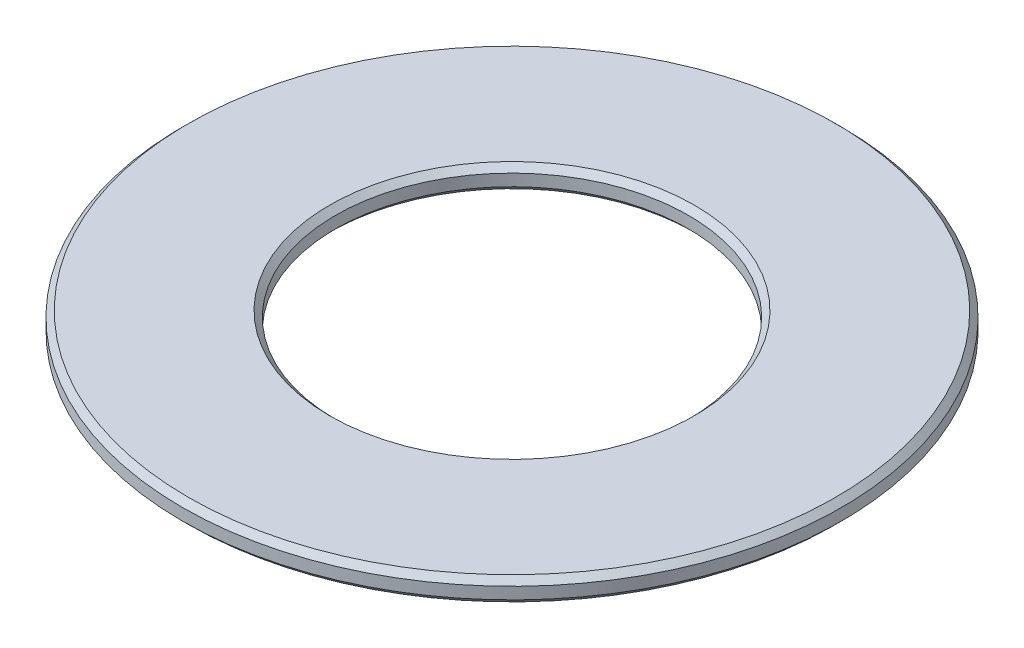
ISO-10303-21;
HEADER;
FILE_DESCRIPTION(('STEP AP214'),'2;1');
FILE_NAME('part.step','',(''),(''),'','','');
FILE_SCHEMA(('AUTOMOTIVE_DESIGN { 1 0 10303 214 1 1 1 1 }'));
ENDSEC;
DATA;
#1=APPLICATION_CONTEXT('core data for automotive mechanical design processes');
#2=APPLICATION_PROTOCOL_DEFINITION('international standard','automotive_design',2000,#1);
#3=PRODUCT_CONTEXT('',#1,'mechanical');
#4=PRODUCT('Part','Part','',(#3));
#5=PRODUCT_RELATED_PRODUCT_CATEGORY('part','',(#4));
#6=PRODUCT_DEFINITION_FORMATION('','',#4);
#7=PRODUCT_DEFINITION_CONTEXT('part definition',#1,'design');
#8=PRODUCT_DEFINITION('design','',#6,#7);
#9=PRODUCT_DEFINITION_SHAPE('','',#8);
#10=(LENGTH_UNIT() NAMED_UNIT(*) SI_UNIT(.MILLI.,.METRE.));
#11=(NAMED_UNIT(*) PLANE_ANGLE_UNIT() SI_UNIT($,.RADIAN.));
#12=(NAMED_UNIT(*) SI_UNIT($,.STERADIAN.) SOLID_ANGLE_UNIT());
#13=UNCERTAINTY_MEASURE_WITH_UNIT(LENGTH_MEASURE(1.E-05),#10,'distance_accuracy_value','');
#14=(GEOMETRIC_REPRESENTATION_CONTEXT(3) GLOBAL_UNCERTAINTY_ASSIGNED_CONTEXT((#13)) GLOBAL_UNIT_ASSIGNED_CONTEXT((#10,
#11,#12)) REPRESENTATION_CONTEXT('',''));
#15=CARTESIAN_POINT('',(0.,0.,0.));
#16=DIRECTION('',(0.,0.,1.));
#17=DIRECTION('',(1.,0.,0.));
#18=AXIS2_PLACEMENT_3D('',#15,#16,#17);
#19=CARTESIAN_POINT('',(0.,1.,0.));
#20=DIRECTION('',(0.,1.,0.));
#21=DIRECTION('',(0.,0.,1.));
#22=AXIS2_PLACEMENT_3D('',#19,#20,#21);
#23=PLANE('',#22);
#24=CARTESIAN_POINT('',(0.,1.,0.));
#25=DIRECTION('',(0.,1.,0.));
#26=DIRECTION('',(0.,0.,1.));
#27=AXIS2_PLACEMENT_3D('',#24,#25,#26);
#28=CIRCLE('',#27,7.75000000000001);
#29=CARTESIAN_POINT('',(0.,1.,7.75000000000001));
#30=VERTEX_POINT('',#29);
#31=EDGE_CURVE('E47',#30,#30,#28,.F.);
#32=ORIENTED_EDGE('',*,*,#31,.T.);
#33=EDGE_LOOP('',(#32));
#34=FACE_BOUND('',#33,.T.);
#35=CARTESIAN_POINT('',(0.,1.,0.));
#36=DIRECTION('',(0.,1.,0.));
#37=DIRECTION('',(0.,0.,1.));
#38=AXIS2_PLACEMENT_3D('',#35,#36,#37);
#39=CIRCLE('',#38,13.75);
#40=CARTESIAN_POINT('',(0.,1.,13.75));
#41=VERTEX_POINT('',#40);
#42=EDGE_CURVE('E51',#41,#41,#39,.T.);
#43=ORIENTED_EDGE('',*,*,#42,.T.);
#44=EDGE_LOOP('',(#43));
#45=FACE_BOUND('',#44,.T.);
#46=ADVANCED_FACE('F35',(#34,#45),#23,.T.);
#47=CARTESIAN_POINT('',(0.,0.,0.));
#48=DIRECTION('',(0.,1.,0.));
#49=DIRECTION('',(0.,0.,1.));
#50=AXIS2_PLACEMENT_3D('',#47,#48,#49);
#51=PLANE('',#50);
#52=CARTESIAN_POINT('',(0.,0.,0.));
#53=DIRECTION('',(0.,1.,0.));
#54=DIRECTION('',(0.,0.,1.));
#55=AXIS2_PLACEMENT_3D('',#52,#53,#54);
#56=CIRCLE('',#55,7.75);
#57=CARTESIAN_POINT('',(0.,0.,7.75));
#58=VERTEX_POINT('',#57);
#59=EDGE_CURVE('E62',#58,#58,#56,.T.);
#60=ORIENTED_EDGE('',*,*,#59,.T.);
#61=EDGE_LOOP('',(#60));
#62=FACE_BOUND('',#61,.T.);
#63=CARTESIAN_POINT('',(0.,0.,0.));
#64=DIRECTION('',(0.,1.,0.));
#65=DIRECTION('',(0.,0.,1.));
#66=AXIS2_PLACEMENT_3D('',#63,#64,#65);
#67=CIRCLE('',#66,13.75);
#68=CARTESIAN_POINT('',(0.,0.,13.75));
#69=VERTEX_POINT('',#68);
#70=EDGE_CURVE('E65',#69,#69,#67,.F.);
#71=ORIENTED_EDGE('',*,*,#70,.T.);
#72=EDGE_LOOP('',(#71));
#73=FACE_BOUND('',#72,.T.);
#74=ADVANCED_FACE('F69',(#62,#73),#51,.F.);
#75=CARTESIAN_POINT('',(0.,1.,0.));
#76=DIRECTION('',(0.,-1.,0.));
#77=DIRECTION('',(0.,0.,-1.));
#78=AXIS2_PLACEMENT_3D('',#75,#76,#77);
#79=CYLINDRICAL_SURFACE('',#78,14.);
#80=CARTESIAN_POINT('',(0.,0.25,0.));
#81=DIRECTION('',(0.,1.,0.));
#82=DIRECTION('',(0.,0.,1.));
#83=AXIS2_PLACEMENT_3D('',#80,#81,#82);
#84=CIRCLE('',#83,14.);
#85=CARTESIAN_POINT('',(0.,0.25,14.));
#86=VERTEX_POINT('',#85);
#87=EDGE_CURVE('E10',#86,#86,#84,.T.);
#88=ORIENTED_EDGE('',*,*,#87,.T.);
#89=EDGE_LOOP('',(#88));
#90=FACE_BOUND('',#89,.T.);
#91=CARTESIAN_POINT('',(0.,0.749999999999988,0.));
#92=DIRECTION('',(0.,1.,0.));
#93=DIRECTION('',(0.,0.,1.));
#94=AXIS2_PLACEMENT_3D('',#91,#92,#93);
#95=CIRCLE('',#94,14.);
#96=CARTESIAN_POINT('',(0.,0.749999999999988,14.));
#97=VERTEX_POINT('',#96);
#98=EDGE_CURVE('E43',#97,#97,#95,.F.);
#99=ORIENTED_EDGE('',*,*,#98,.T.);
#100=EDGE_LOOP('',(#99));
#101=FACE_BOUND('',#100,.T.);
#102=ADVANCED_FACE('F90',(#90,#101),#79,.T.);
#103=CARTESIAN_POINT('',(0.,1.,0.));
#104=DIRECTION('',(0.,-1.,0.));
#105=DIRECTION('',(0.,0.,-1.));
#106=AXIS2_PLACEMENT_3D('',#103,#104,#105);
#107=CYLINDRICAL_SURFACE('',#106,7.5);
#108=CARTESIAN_POINT('',(0.,0.250000000000002,0.));
#109=DIRECTION('',(0.,1.,0.));
#110=DIRECTION('',(0.,0.,1.));
#111=AXIS2_PLACEMENT_3D('',#108,#109,#110);
#112=CIRCLE('',#111,7.5);
#113=CARTESIAN_POINT('',(0.,0.250000000000002,7.5));
#114=VERTEX_POINT('',#113);
#115=EDGE_CURVE('E56',#114,#114,#112,.F.);
#116=ORIENTED_EDGE('',*,*,#115,.T.);
#117=EDGE_LOOP('',(#116));
#118=FACE_BOUND('',#117,.T.);
#119=CARTESIAN_POINT('',(0.,0.74999999999999,0.));
#120=DIRECTION('',(0.,1.,0.));
#121=DIRECTION('',(0.,0.,1.));
#122=AXIS2_PLACEMENT_3D('',#119,#120,#121);
#123=CIRCLE('',#122,7.5);
#124=CARTESIAN_POINT('',(0.,0.74999999999999,7.5));
#125=VERTEX_POINT('',#124);
#126=EDGE_CURVE('E59',#125,#125,#123,.T.);
#127=ORIENTED_EDGE('',*,*,#126,.T.);
#128=EDGE_LOOP('',(#127));
#129=FACE_BOUND('',#128,.T.);
#130=ADVANCED_FACE('F95',(#118,#129),#107,.F.);
#131=CARTESIAN_POINT('',(0.,0.,0.));
#132=DIRECTION('',(0.,-1.,0.));
#133=DIRECTION('',(0.,0.,-1.));
#134=AXIS2_PLACEMENT_3D('',#131,#132,#133);
#135=CONICAL_SURFACE('',#134,7.75,0.785398163397436);
#136=ORIENTED_EDGE('',*,*,#115,.F.);
#137=EDGE_LOOP('',(#136));
#138=FACE_BOUND('',#137,.T.);
#139=ORIENTED_EDGE('',*,*,#59,.F.);
#140=EDGE_LOOP('',(#139));
#141=FACE_BOUND('',#140,.T.);
#142=ADVANCED_FACE('F80',(#138,#141),#135,.F.);
#143=CARTESIAN_POINT('',(0.,0.74999999999999,0.));
#144=DIRECTION('',(0.,1.,0.));
#145=DIRECTION('',(0.,0.,1.));
#146=AXIS2_PLACEMENT_3D('',#143,#144,#145);
#147=CONICAL_SURFACE('',#146,7.5,0.785398163397452);
#148=CARTESIAN_POINT('',(0.,1.,7.75000000000001));
#149=CARTESIAN_POINT('',(0.,0.997395833333333,7.74739583333334));
#150=CARTESIAN_POINT('',(0.,0.994791666666666,7.74479166666668));
#151=CARTESIAN_POINT('',(0.,0.989583333333333,7.73958333333334));
#152=CARTESIAN_POINT('',(0.,0.986979166666666,7.73697916666668));
#153=CARTESIAN_POINT('',(0.,0.981770833333333,7.73177083333334));
#154=CARTESIAN_POINT('',(0.,0.979166666666666,7.72916666666668));
#155=CARTESIAN_POINT('',(0.,0.973958333333332,7.72395833333334));
#156=CARTESIAN_POINT('',(0.,0.971354166666666,7.72135416666668));
#157=CARTESIAN_POINT('',(0.,0.966145833333332,7.71614583333334));
#158=CARTESIAN_POINT('',(0.,0.963541666666665,7.71354166666668));
#159=CARTESIAN_POINT('',(0.,0.958333333333332,7.70833333333334));
#160=CARTESIAN_POINT('',(0.,0.955729166666665,7.70572916666668));
#161=CARTESIAN_POINT('',(0.,0.950520833333331,7.70052083333334));
#162=CARTESIAN_POINT('',(0.,0.947916666666665,7.69791666666667));
#163=CARTESIAN_POINT('',(0.,0.942708333333331,7.69270833333334));
#164=CARTESIAN_POINT('',(0.,0.940104166666664,7.69010416666667));
#165=CARTESIAN_POINT('',(0.,0.934895833333331,7.68489583333334));
#166=CARTESIAN_POINT('',(0.,0.932291666666664,7.68229166666667));
#167=CARTESIAN_POINT('',(0.,0.92708333333333,7.67708333333334));
#168=CARTESIAN_POINT('',(0.,0.924479166666664,7.67447916666667));
#169=CARTESIAN_POINT('',(0.,0.91927083333333,7.66927083333334));
#170=CARTESIAN_POINT('',(0.,0.916666666666663,7.66666666666667));
#171=CARTESIAN_POINT('',(0.,0.91145833333333,7.66145833333334));
#172=CARTESIAN_POINT('',(0.,0.908854166666663,7.65885416666667));
#173=CARTESIAN_POINT('',(0.,0.903645833333329,7.65364583333334));
#174=CARTESIAN_POINT('',(0.,0.901041666666663,7.65104166666667));
#175=CARTESIAN_POINT('',(0.,0.895833333333329,7.64583333333334));
#176=CARTESIAN_POINT('',(0.,0.893229166666662,7.64322916666667));
#177=CARTESIAN_POINT('',(0.,0.888020833333329,7.63802083333334));
#178=CARTESIAN_POINT('',(0.,0.885416666666662,7.63541666666667));
#179=CARTESIAN_POINT('',(0.,0.880208333333329,7.63020833333334));
#180=CARTESIAN_POINT('',(0.,0.877604166666662,7.62760416666667));
#181=CARTESIAN_POINT('',(0.,0.872395833333328,7.62239583333334));
#182=CARTESIAN_POINT('',(0.,0.869791666666662,7.61979166666667));
#183=CARTESIAN_POINT('',(0.,0.864583333333328,7.61458333333334));
#184=CARTESIAN_POINT('',(0.,0.861979166666661,7.61197916666667));
#185=CARTESIAN_POINT('',(0.,0.856770833333328,7.60677083333334));
#186=CARTESIAN_POINT('',(0.,0.854166666666661,7.60416666666667));
#187=CARTESIAN_POINT('',(0.,0.848958333333327,7.59895833333334));
#188=CARTESIAN_POINT('',(0.,0.846354166666661,7.59635416666667));
#189=CARTESIAN_POINT('',(0.,0.841145833333327,7.59114583333334));
#190=CARTESIAN_POINT('',(0.,0.83854166666666,7.58854166666667));
#191=CARTESIAN_POINT('',(0.,0.833333333333327,7.58333333333334));
#192=CARTESIAN_POINT('',(0.,0.83072916666666,7.58072916666667));
#193=CARTESIAN_POINT('',(0.,0.825520833333326,7.57552083333334));
#194=CARTESIAN_POINT('',(0.,0.82291666666666,7.57291666666667));
#195=CARTESIAN_POINT('',(0.,0.817708333333326,7.56770833333334));
#196=CARTESIAN_POINT('',(0.,0.815104166666659,7.56510416666667));
#197=CARTESIAN_POINT('',(0.,0.809895833333326,7.55989583333334));
#198=CARTESIAN_POINT('',(0.,0.807291666666659,7.55729166666667));
#199=CARTESIAN_POINT('',(0.,0.802083333333326,7.55208333333333));
#200=CARTESIAN_POINT('',(0.,0.799479166666659,7.54947916666667));
#201=CARTESIAN_POINT('',(0.,0.794270833333325,7.54427083333333));
#202=CARTESIAN_POINT('',(0.,0.791666666666659,7.54166666666667));
#203=CARTESIAN_POINT('',(0.,0.786458333333325,7.53645833333333));
#204=CARTESIAN_POINT('',(0.,0.783854166666658,7.53385416666667));
#205=CARTESIAN_POINT('',(0.,0.778645833333325,7.52864583333333));
#206=CARTESIAN_POINT('',(0.,0.776041666666658,7.52604166666667));
#207=CARTESIAN_POINT('',(0.,0.770833333333324,7.52083333333333));
#208=CARTESIAN_POINT('',(0.,0.768229166666658,7.51822916666667));
#209=CARTESIAN_POINT('',(0.,0.763020833333324,7.51302083333333));
#210=CARTESIAN_POINT('',(0.,0.760416666666657,7.51041666666667));
#211=CARTESIAN_POINT('',(0.,0.755208333333324,7.50520833333333));
#212=CARTESIAN_POINT('',(0.,0.752604166666657,7.50260416666667));
#213=CARTESIAN_POINT('',(0.,0.74999999999999,7.5));
#214=B_SPLINE_CURVE_WITH_KNOTS('',3,(#148,#149,#150,#151,#152,#153,#154,#155,#156,#157,#158,
#159,#160,#161,#162,#163,#164,#165,#166,#167,#168,#169,#170,#171,#172,#173,#174,#175,#176,#177,
#178,#179,#180,#181,#182,#183,#184,#185,#186,#187,#188,#189,#190,#191,#192,#193,#194,#195,#196,
#197,#198,#199,#200,#201,#202,#203,#204,#205,#206,#207,#208,#209,#210,#211,#212,#213),
.UNSPECIFIED.,.F.,.F.,(4,2,2,2,2,2,2,2,2,2,2,2,2,2,2,2,2,2,2,2,2,2,2,2,2,2,2,2,2,2,2,2,4),(0.,
0.0110485434560406,0.0220970869120805,0.0331456303681207,0.0441941738241612,0.0552427172802013,
0.0662912607362419,0.0773398041922819,0.088388347648322,0.0994368911043626,0.110485434560403,
0.121533978016443,0.132582521472483,0.143631064928523,0.154679608384564,0.165728151840604,
0.176776695296645,0.187825238752685,0.198873782208725,0.209922325664765,0.220970869120805,
0.232019412576846,0.243067956032886,0.254116499488926,0.265165042944967,0.276213586401007,
0.287262129857047,0.298310673313087,0.309359216769127,0.320407760225168,0.331456303681208,
0.342504847137249,0.353553390593289),.UNSPECIFIED.);
#215=EDGE_CURVE('BSEAM74',#30,#125,#214,.T.);
#216=ORIENTED_EDGE('',*,*,#31,.F.);
#217=ORIENTED_EDGE('',*,*,#126,.F.);
#218=ORIENTED_EDGE('',*,*,#215,.T.);
#219=ORIENTED_EDGE('',*,*,#215,.F.);
#220=EDGE_LOOP('',(#216,#218,#217,#219));
#221=FACE_BOUND('',#220,.T.);
#222=ADVANCED_FACE('F74',(#221),#147,.F.);
#223=CARTESIAN_POINT('',(0.,0.25,0.));
#224=DIRECTION('',(0.,1.,0.));
#225=DIRECTION('',(0.,0.,1.));
#226=AXIS2_PLACEMENT_3D('',#223,#224,#225);
#227=CONICAL_SURFACE('',#226,14.,0.785398163397452);
#228=ORIENTED_EDGE('',*,*,#70,.F.);
#229=EDGE_LOOP('',(#228));
#230=FACE_BOUND('',#229,.T.);
#231=ORIENTED_EDGE('',*,*,#87,.F.);
#232=EDGE_LOOP('',(#231));
#233=FACE_BOUND('',#232,.T.);
#234=ADVANCED_FACE('F71',(#230,#233),#227,.T.);
#235=CARTESIAN_POINT('',(0.,1.,0.));
#236=DIRECTION('',(0.,-1.,0.));
#237=DIRECTION('',(0.,0.,-1.));
#238=AXIS2_PLACEMENT_3D('',#235,#236,#237);
#239=CONICAL_SURFACE('',#238,13.75,0.785398163397445);
#240=ORIENTED_EDGE('',*,*,#98,.F.);
#241=EDGE_LOOP('',(#240));
#242=FACE_BOUND('',#241,.T.);
#243=ORIENTED_EDGE('',*,*,#42,.F.);
#244=EDGE_LOOP('',(#243));
#245=FACE_BOUND('',#244,.T.);
#246=ADVANCED_FACE('F38',(#242,#245),#239,.T.);
#247=CLOSED_SHELL('',(#46,#74,#102,#130,#142,#222,#234,#246));
#248=MANIFOLD_SOLID_BREP('B2',#247);
#249=ADVANCED_BREP_SHAPE_REPRESENTATION('',(#18,#248),#14);
#250=SHAPE_DEFINITION_REPRESENTATION(#9,#249);
ENDSEC;
END-ISO-10303-21;
